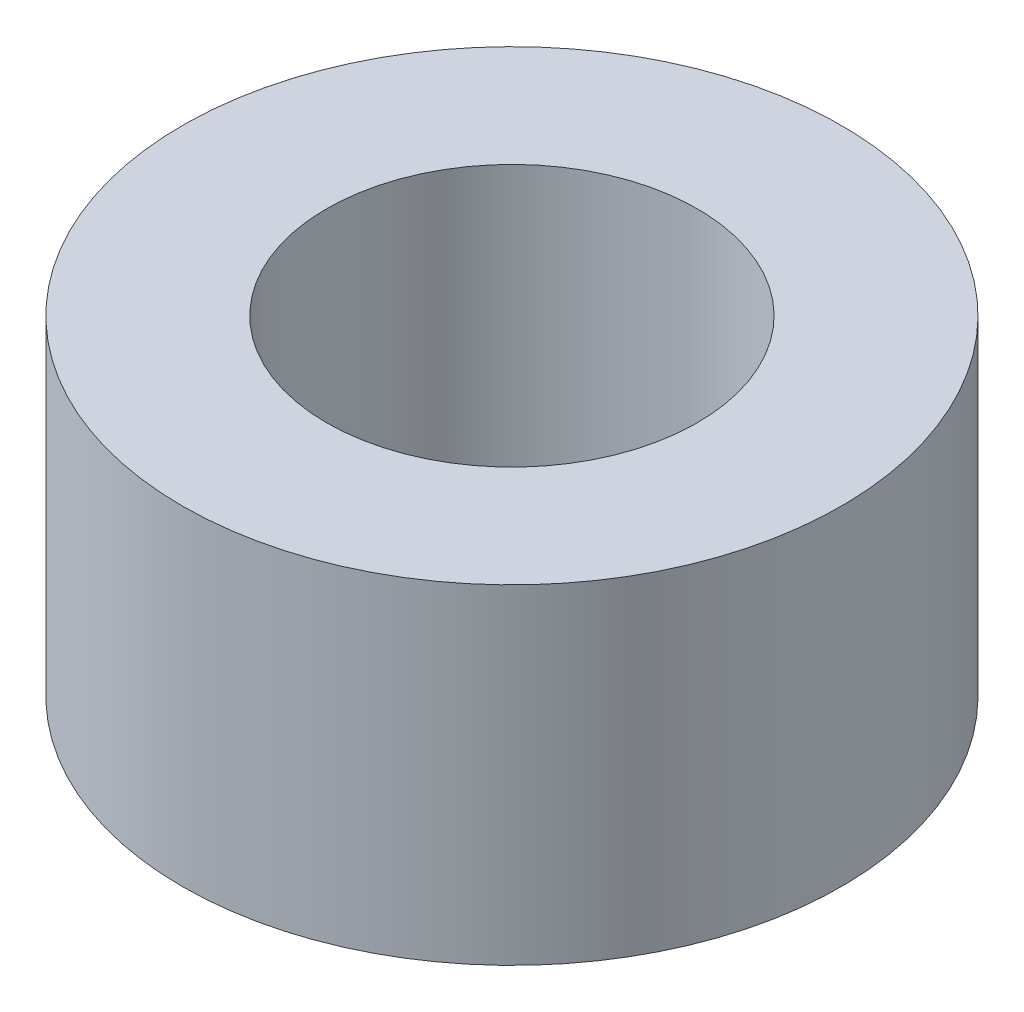
ISO-10303-21;
HEADER;
FILE_DESCRIPTION(('STEP AP214'),'2;1');
FILE_NAME('part.step','',(''),(''),'','','');
FILE_SCHEMA(('AUTOMOTIVE_DESIGN { 1 0 10303 214 1 1 1 1 }'));
ENDSEC;
DATA;
#1=APPLICATION_CONTEXT('core data for automotive mechanical design processes');
#2=APPLICATION_PROTOCOL_DEFINITION('international standard','automotive_design',2000,#1);
#3=PRODUCT_CONTEXT('',#1,'mechanical');
#4=PRODUCT('Part','Part','',(#3));
#5=PRODUCT_RELATED_PRODUCT_CATEGORY('part','',(#4));
#6=PRODUCT_DEFINITION_FORMATION('','',#4);
#7=PRODUCT_DEFINITION_CONTEXT('part definition',#1,'design');
#8=PRODUCT_DEFINITION('design','',#6,#7);
#9=PRODUCT_DEFINITION_SHAPE('','',#8);
#10=(LENGTH_UNIT() NAMED_UNIT(*) SI_UNIT(.MILLI.,.METRE.));
#11=(NAMED_UNIT(*) PLANE_ANGLE_UNIT() SI_UNIT($,.RADIAN.));
#12=(NAMED_UNIT(*) SI_UNIT($,.STERADIAN.) SOLID_ANGLE_UNIT());
#13=UNCERTAINTY_MEASURE_WITH_UNIT(LENGTH_MEASURE(1.E-05),#10,'distance_accuracy_value','');
#14=(GEOMETRIC_REPRESENTATION_CONTEXT(3) GLOBAL_UNCERTAINTY_ASSIGNED_CONTEXT((#13)) GLOBAL_UNIT_ASSIGNED_CONTEXT((#10,
#11,#12)) REPRESENTATION_CONTEXT('',''));
#15=CARTESIAN_POINT('',(0.,0.,0.));
#16=DIRECTION('',(0.,0.,1.));
#17=DIRECTION('',(1.,0.,0.));
#18=AXIS2_PLACEMENT_3D('',#15,#16,#17);
#19=CARTESIAN_POINT('',(0.,4.,0.));
#20=DIRECTION('',(0.,1.,0.));
#21=DIRECTION('',(0.,0.,1.));
#22=AXIS2_PLACEMENT_3D('',#19,#20,#21);
#23=PLANE('',#22);
#24=CARTESIAN_POINT('',(0.,4.,0.));
#25=DIRECTION('',(0.,1.,0.));
#26=DIRECTION('',(0.,0.,1.));
#27=AXIS2_PLACEMENT_3D('',#24,#25,#26);
#28=CIRCLE('',#27,4.);
#29=CARTESIAN_POINT('',(0.,4.,4.));
#30=VERTEX_POINT('',#29);
#31=EDGE_CURVE('E10',#30,#30,#28,.T.);
#32=ORIENTED_EDGE('',*,*,#31,.T.);
#33=EDGE_LOOP('',(#32));
#34=FACE_BOUND('',#33,.T.);
#35=CARTESIAN_POINT('',(0.,4.,0.));
#36=DIRECTION('',(0.,1.,0.));
#37=DIRECTION('',(0.,0.,1.));
#38=AXIS2_PLACEMENT_3D('',#35,#36,#37);
#39=CIRCLE('',#38,2.25);
#40=CARTESIAN_POINT('',(0.,4.,2.25));
#41=VERTEX_POINT('',#40);
#42=EDGE_CURVE('E43',#41,#41,#39,.T.);
#43=ORIENTED_EDGE('',*,*,#42,.F.);
#44=EDGE_LOOP('',(#43));
#45=FACE_BOUND('',#44,.T.);
#46=ADVANCED_FACE('F32',(#34,#45),#23,.T.);
#47=CARTESIAN_POINT('',(0.,0.,0.));
#48=DIRECTION('',(0.,1.,0.));
#49=DIRECTION('',(0.,0.,1.));
#50=AXIS2_PLACEMENT_3D('',#47,#48,#49);
#51=PLANE('',#50);
#52=CARTESIAN_POINT('',(0.,0.,0.));
#53=DIRECTION('',(0.,1.,0.));
#54=DIRECTION('',(0.,0.,1.));
#55=AXIS2_PLACEMENT_3D('',#52,#53,#54);
#56=CIRCLE('',#55,4.);
#57=CARTESIAN_POINT('',(0.,0.,4.));
#58=VERTEX_POINT('',#57);
#59=EDGE_CURVE('E36',#58,#58,#56,.T.);
#60=ORIENTED_EDGE('',*,*,#59,.F.);
#61=EDGE_LOOP('',(#60));
#62=FACE_BOUND('',#61,.T.);
#63=CARTESIAN_POINT('',(0.,0.,0.));
#64=DIRECTION('',(0.,1.,0.));
#65=DIRECTION('',(0.,0.,1.));
#66=AXIS2_PLACEMENT_3D('',#63,#64,#65);
#67=CIRCLE('',#66,2.25);
#68=CARTESIAN_POINT('',(0.,0.,2.25));
#69=VERTEX_POINT('',#68);
#70=EDGE_CURVE('E45',#69,#69,#67,.T.);
#71=ORIENTED_EDGE('',*,*,#70,.T.);
#72=EDGE_LOOP('',(#71));
#73=FACE_BOUND('',#72,.T.);
#74=ADVANCED_FACE('F55',(#62,#73),#51,.F.);
#75=CARTESIAN_POINT('',(0.,4.,0.));
#76=DIRECTION('',(0.,-1.,0.));
#77=DIRECTION('',(0.,0.,-1.));
#78=AXIS2_PLACEMENT_3D('',#75,#76,#77);
#79=CYLINDRICAL_SURFACE('',#78,4.);
#80=ORIENTED_EDGE('',*,*,#31,.F.);
#81=EDGE_LOOP('',(#80));
#82=FACE_BOUND('',#81,.T.);
#83=ORIENTED_EDGE('',*,*,#59,.T.);
#84=EDGE_LOOP('',(#83));
#85=FACE_BOUND('',#84,.T.);
#86=ADVANCED_FACE('F34',(#82,#85),#79,.T.);
#87=CARTESIAN_POINT('',(0.,4.,0.));
#88=DIRECTION('',(0.,-1.,0.));
#89=DIRECTION('',(0.,0.,-1.));
#90=AXIS2_PLACEMENT_3D('',#87,#88,#89);
#91=CYLINDRICAL_SURFACE('',#90,2.25);
#92=ORIENTED_EDGE('',*,*,#42,.T.);
#93=EDGE_LOOP('',(#92));
#94=FACE_BOUND('',#93,.T.);
#95=ORIENTED_EDGE('',*,*,#70,.F.);
#96=EDGE_LOOP('',(#95));
#97=FACE_BOUND('',#96,.T.);
#98=ADVANCED_FACE('F51',(#94,#97),#91,.F.);
#99=CLOSED_SHELL('',(#46,#74,#86,#98));
#100=MANIFOLD_SOLID_BREP('B2',#99);
#101=ADVANCED_BREP_SHAPE_REPRESENTATION('',(#18,#100),#14);
#102=SHAPE_DEFINITION_REPRESENTATION(#9,#101);
ENDSEC;
END-ISO-10303-21;
